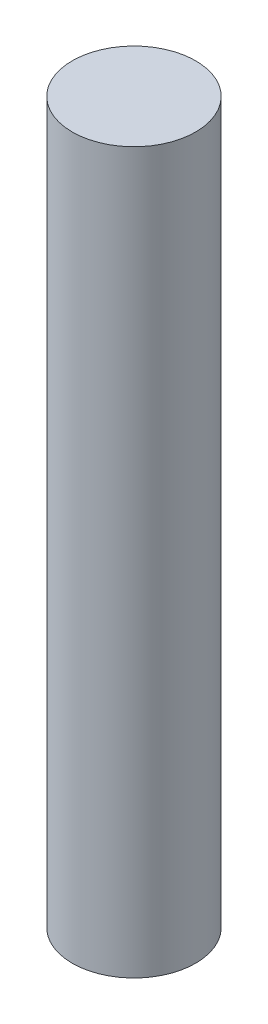
ISO-10303-21;
HEADER;
FILE_DESCRIPTION(('STEP AP214'),'2;1');
FILE_NAME('part.step','',(''),(''),'','','');
FILE_SCHEMA(('AUTOMOTIVE_DESIGN { 1 0 10303 214 1 1 1 1 }'));
ENDSEC;
DATA;
#1=APPLICATION_CONTEXT('core data for automotive mechanical design processes');
#2=APPLICATION_PROTOCOL_DEFINITION('international standard','automotive_design',2000,#1);
#3=PRODUCT_CONTEXT('',#1,'mechanical');
#4=PRODUCT('Part','Part','',(#3));
#5=PRODUCT_RELATED_PRODUCT_CATEGORY('part','',(#4));
#6=PRODUCT_DEFINITION_FORMATION('','',#4);
#7=PRODUCT_DEFINITION_CONTEXT('part definition',#1,'design');
#8=PRODUCT_DEFINITION('design','',#6,#7);
#9=PRODUCT_DEFINITION_SHAPE('','',#8);
#10=(LENGTH_UNIT() NAMED_UNIT(*) SI_UNIT(.MILLI.,.METRE.));
#11=(NAMED_UNIT(*) PLANE_ANGLE_UNIT() SI_UNIT($,.RADIAN.));
#12=(NAMED_UNIT(*) SI_UNIT($,.STERADIAN.) SOLID_ANGLE_UNIT());
#13=UNCERTAINTY_MEASURE_WITH_UNIT(LENGTH_MEASURE(1.E-05),#10,'distance_accuracy_value','');
#14=(GEOMETRIC_REPRESENTATION_CONTEXT(3) GLOBAL_UNCERTAINTY_ASSIGNED_CONTEXT((#13)) GLOBAL_UNIT_ASSIGNED_CONTEXT((#10,
#11,#12)) REPRESENTATION_CONTEXT('',''));
#15=CARTESIAN_POINT('',(0.,0.,0.));
#16=DIRECTION('',(0.,0.,1.));
#17=DIRECTION('',(1.,0.,0.));
#18=AXIS2_PLACEMENT_3D('',#15,#16,#17);
#19=CARTESIAN_POINT('',(0.,14.,0.));
#20=DIRECTION('',(0.,-1.,0.));
#21=DIRECTION('',(0.,0.,-1.));
#22=AXIS2_PLACEMENT_3D('',#19,#20,#21);
#23=CYLINDRICAL_SURFACE('',#22,2.4);
#24=CARTESIAN_POINT('',(0.,14.,0.));
#25=DIRECTION('',(0.,1.,0.));
#26=DIRECTION('',(0.,0.,1.));
#27=AXIS2_PLACEMENT_3D('',#24,#25,#26);
#28=CIRCLE('',#27,2.4);
#29=CARTESIAN_POINT('',(0.,14.,2.4));
#30=VERTEX_POINT('',#29);
#31=EDGE_CURVE('E10',#30,#30,#28,.T.);
#32=ORIENTED_EDGE('',*,*,#31,.F.);
#33=EDGE_LOOP('',(#32));
#34=FACE_BOUND('',#33,.T.);
#35=CARTESIAN_POINT('',(0.,-14.,0.));
#36=DIRECTION('',(0.,1.,0.));
#37=DIRECTION('',(0.,0.,1.));
#38=AXIS2_PLACEMENT_3D('',#35,#36,#37);
#39=CIRCLE('',#38,2.4);
#40=CARTESIAN_POINT('',(0.,-14.,2.4));
#41=VERTEX_POINT('',#40);
#42=EDGE_CURVE('E40',#41,#41,#39,.T.);
#43=ORIENTED_EDGE('',*,*,#42,.T.);
#44=EDGE_LOOP('',(#43));
#45=FACE_BOUND('',#44,.T.);
#46=ADVANCED_FACE('F37',(#34,#45),#23,.T.);
#47=CARTESIAN_POINT('',(0.,14.,0.));
#48=DIRECTION('',(0.,1.,0.));
#49=DIRECTION('',(0.,0.,1.));
#50=AXIS2_PLACEMENT_3D('',#47,#48,#49);
#51=PLANE('',#50);
#52=ORIENTED_EDGE('',*,*,#31,.T.);
#53=EDGE_LOOP('',(#52));
#54=FACE_BOUND('',#53,.T.);
#55=ADVANCED_FACE('F52',(#54),#51,.T.);
#56=CARTESIAN_POINT('',(0.,-14.,0.));
#57=DIRECTION('',(0.,1.,0.));
#58=DIRECTION('',(0.,0.,1.));
#59=AXIS2_PLACEMENT_3D('',#56,#57,#58);
#60=PLANE('',#59);
#61=ORIENTED_EDGE('',*,*,#42,.F.);
#62=EDGE_LOOP('',(#61));
#63=FACE_BOUND('',#62,.T.);
#64=ADVANCED_FACE('F50',(#63),#60,.F.);
#65=CLOSED_SHELL('',(#46,#55,#64));
#66=MANIFOLD_SOLID_BREP('B2',#65);
#67=ADVANCED_BREP_SHAPE_REPRESENTATION('',(#18,#66),#14);
#68=SHAPE_DEFINITION_REPRESENTATION(#9,#67);
ENDSEC;
END-ISO-10303-21;
